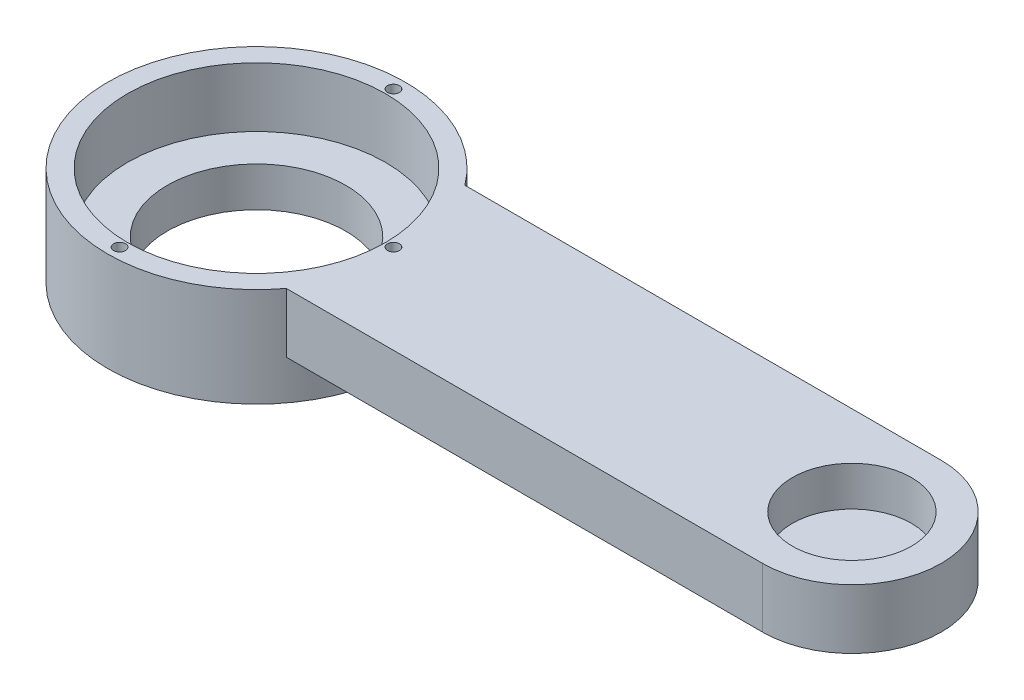
ISO-10303-21;
HEADER;
FILE_DESCRIPTION(('STEP AP214'),'2;1');
FILE_NAME('part.step','',(''),(''),'','','');
FILE_SCHEMA(('AUTOMOTIVE_DESIGN { 1 0 10303 214 1 1 1 1 }'));
ENDSEC;
DATA;
#1=APPLICATION_CONTEXT('core data for automotive mechanical design processes');
#2=APPLICATION_PROTOCOL_DEFINITION('international standard','automotive_design',2000,#1);
#3=PRODUCT_CONTEXT('',#1,'mechanical');
#4=PRODUCT('Part','Part','',(#3));
#5=PRODUCT_RELATED_PRODUCT_CATEGORY('part','',(#4));
#6=PRODUCT_DEFINITION_FORMATION('','',#4);
#7=PRODUCT_DEFINITION_CONTEXT('part definition',#1,'design');
#8=PRODUCT_DEFINITION('design','',#6,#7);
#9=PRODUCT_DEFINITION_SHAPE('','',#8);
#10=(LENGTH_UNIT() NAMED_UNIT(*) SI_UNIT(.MILLI.,.METRE.));
#11=(NAMED_UNIT(*) PLANE_ANGLE_UNIT() SI_UNIT($,.RADIAN.));
#12=(NAMED_UNIT(*) SI_UNIT($,.STERADIAN.) SOLID_ANGLE_UNIT());
#13=UNCERTAINTY_MEASURE_WITH_UNIT(LENGTH_MEASURE(1.E-05),#10,'distance_accuracy_value','');
#14=(GEOMETRIC_REPRESENTATION_CONTEXT(3) GLOBAL_UNCERTAINTY_ASSIGNED_CONTEXT((#13)) GLOBAL_UNIT_ASSIGNED_CONTEXT((#10,
#11,#12)) REPRESENTATION_CONTEXT('',''));
#15=CARTESIAN_POINT('',(0.,0.,0.));
#16=DIRECTION('',(0.,0.,1.));
#17=DIRECTION('',(1.,0.,0.));
#18=AXIS2_PLACEMENT_3D('',#15,#16,#17);
#19=CARTESIAN_POINT('',(150.,15.,0.));
#20=DIRECTION('',(0.,-1.,0.));
#21=DIRECTION('',(0.,0.,-1.));
#22=AXIS2_PLACEMENT_3D('',#19,#20,#21);
#23=CYLINDRICAL_SURFACE('',#22,15.);
#24=CARTESIAN_POINT('',(150.,15.,0.));
#25=DIRECTION('',(0.,-1.,0.));
#26=DIRECTION('',(0.,0.,-1.));
#27=AXIS2_PLACEMENT_3D('',#24,#25,#26);
#28=CIRCLE('',#27,15.);
#29=CARTESIAN_POINT('',(150.,15.,-15.));
#30=VERTEX_POINT('',#29);
#31=EDGE_CURVE('E118',#30,#30,#28,.T.);
#32=ORIENTED_EDGE('',*,*,#31,.F.);
#33=EDGE_LOOP('',(#32));
#34=FACE_BOUND('',#33,.T.);
#35=CARTESIAN_POINT('',(150.,5.,0.));
#36=DIRECTION('',(0.,-1.,0.));
#37=DIRECTION('',(0.,0.,-1.));
#38=AXIS2_PLACEMENT_3D('',#35,#36,#37);
#39=CIRCLE('',#38,15.);
#40=CARTESIAN_POINT('',(150.,5.,-15.));
#41=VERTEX_POINT('',#40);
#42=EDGE_CURVE('E12',#41,#41,#39,.F.);
#43=ORIENTED_EDGE('',*,*,#42,.F.);
#44=EDGE_LOOP('',(#43));
#45=FACE_BOUND('',#44,.T.);
#46=ADVANCED_FACE('F41',(#34,#45),#23,.F.);
#47=CARTESIAN_POINT('',(0.,-10.,0.));
#48=DIRECTION('',(0.,1.,0.));
#49=DIRECTION('',(0.,0.,1.));
#50=AXIS2_PLACEMENT_3D('',#47,#48,#49);
#51=CYLINDRICAL_SURFACE('',#50,22.5);
#52=CARTESIAN_POINT('',(0.,-10.,0.));
#53=DIRECTION('',(0.,1.,0.));
#54=DIRECTION('',(0.,0.,1.));
#55=AXIS2_PLACEMENT_3D('',#52,#53,#54);
#56=CIRCLE('',#55,22.5);
#57=CARTESIAN_POINT('',(0.,-10.,22.5));
#58=VERTEX_POINT('',#57);
#59=EDGE_CURVE('E105',#58,#58,#56,.T.);
#60=ORIENTED_EDGE('',*,*,#59,.F.);
#61=EDGE_LOOP('',(#60));
#62=FACE_BOUND('',#61,.T.);
#63=CARTESIAN_POINT('',(0.,0.,0.));
#64=DIRECTION('',(0.,1.,0.));
#65=DIRECTION('',(0.,0.,1.));
#66=AXIS2_PLACEMENT_3D('',#63,#64,#65);
#67=CIRCLE('',#66,22.5);
#68=CARTESIAN_POINT('',(0.,0.,22.5));
#69=VERTEX_POINT('',#68);
#70=EDGE_CURVE('E103',#69,#69,#67,.F.);
#71=ORIENTED_EDGE('',*,*,#70,.F.);
#72=EDGE_LOOP('',(#71));
#73=FACE_BOUND('',#72,.T.);
#74=ADVANCED_FACE('F154',(#62,#73),#51,.F.);
#75=CARTESIAN_POINT('',(0.,15.,22.5));
#76=DIRECTION('',(0.,0.,-1.));
#77=DIRECTION('',(-1.,0.,0.));
#78=AXIS2_PLACEMENT_3D('',#75,#76,#77);
#79=PLANE('',#78);
#80=DIRECTION('',(1.,0.,0.));
#81=VECTOR('',#80,1.);
#82=CARTESIAN_POINT('',(0.,15.,22.5));
#83=LINE('',#82,#81);
#84=CARTESIAN_POINT('',(30.,15.,22.5));
#85=VERTEX_POINT('',#84);
#86=CARTESIAN_POINT('',(150.,15.,22.5));
#87=VERTEX_POINT('',#86);
#88=EDGE_CURVE('E97',#85,#87,#83,.T.);
#89=ORIENTED_EDGE('',*,*,#88,.F.);
#90=DIRECTION('',(0.,1.,0.));
#91=VECTOR('',#90,1.);
#92=CARTESIAN_POINT('',(30.,-10.,22.5));
#93=LINE('',#92,#91);
#94=CARTESIAN_POINT('',(30.,0.,22.5));
#95=VERTEX_POINT('',#94);
#96=EDGE_CURVE('E128',#85,#95,#93,.F.);
#97=ORIENTED_EDGE('',*,*,#96,.T.);
#98=DIRECTION('',(1.,0.,0.));
#99=VECTOR('',#98,1.);
#100=CARTESIAN_POINT('',(0.,0.,22.5));
#101=LINE('',#100,#99);
#102=CARTESIAN_POINT('',(150.,0.,22.5));
#103=VERTEX_POINT('',#102);
#104=EDGE_CURVE('E89',#95,#103,#101,.T.);
#105=ORIENTED_EDGE('',*,*,#104,.T.);
#106=DIRECTION('',(0.,-1.,0.));
#107=VECTOR('',#106,1.);
#108=CARTESIAN_POINT('',(150.,15.,22.5));
#109=LINE('',#108,#107);
#110=EDGE_CURVE('E84',#87,#103,#109,.T.);
#111=ORIENTED_EDGE('',*,*,#110,.F.);
#112=EDGE_LOOP('',(#89,#97,#105,#111));
#113=FACE_BOUND('',#112,.T.);
#114=ADVANCED_FACE('F43',(#113),#79,.F.);
#115=CARTESIAN_POINT('',(150.,15.,0.));
#116=DIRECTION('',(0.,-1.,0.));
#117=DIRECTION('',(0.,0.,-1.));
#118=AXIS2_PLACEMENT_3D('',#115,#116,#117);
#119=CYLINDRICAL_SURFACE('',#118,22.5);
#120=CARTESIAN_POINT('',(150.,0.,0.));
#121=DIRECTION('',(0.,1.,0.));
#122=DIRECTION('',(0.,0.,1.));
#123=AXIS2_PLACEMENT_3D('',#120,#121,#122);
#124=CIRCLE('',#123,22.5);
#125=CARTESIAN_POINT('',(150.,0.,-22.5));
#126=VERTEX_POINT('',#125);
#127=EDGE_CURVE('E78',#103,#126,#124,.T.);
#128=ORIENTED_EDGE('',*,*,#127,.T.);
#129=DIRECTION('',(0.,-1.,0.));
#130=VECTOR('',#129,1.);
#131=CARTESIAN_POINT('',(150.,15.,-22.5));
#132=LINE('',#131,#130);
#133=CARTESIAN_POINT('',(150.,15.,-22.5));
#134=VERTEX_POINT('',#133);
#135=EDGE_CURVE('E81',#134,#126,#132,.T.);
#136=ORIENTED_EDGE('',*,*,#135,.F.);
#137=CARTESIAN_POINT('',(150.,15.,0.));
#138=DIRECTION('',(0.,1.,0.));
#139=DIRECTION('',(0.,0.,1.));
#140=AXIS2_PLACEMENT_3D('',#137,#138,#139);
#141=CIRCLE('',#140,22.5);
#142=EDGE_CURVE('E65',#87,#134,#141,.T.);
#143=ORIENTED_EDGE('',*,*,#142,.F.);
#144=ORIENTED_EDGE('',*,*,#110,.T.);
#145=EDGE_LOOP('',(#128,#136,#143,#144));
#146=FACE_BOUND('',#145,.T.);
#147=ADVANCED_FACE('F80',(#146),#119,.T.);
#148=CARTESIAN_POINT('',(0.,15.,-22.5));
#149=DIRECTION('',(0.,0.,1.));
#150=DIRECTION('',(1.,0.,0.));
#151=AXIS2_PLACEMENT_3D('',#148,#149,#150);
#152=PLANE('',#151);
#153=DIRECTION('',(-1.,0.,0.));
#154=VECTOR('',#153,1.);
#155=CARTESIAN_POINT('',(0.,0.,-22.5));
#156=LINE('',#155,#154);
#157=CARTESIAN_POINT('',(30.,0.,-22.5));
#158=VERTEX_POINT('',#157);
#159=EDGE_CURVE('E88',#126,#158,#156,.T.);
#160=ORIENTED_EDGE('',*,*,#159,.T.);
#161=DIRECTION('',(0.,1.,0.));
#162=VECTOR('',#161,1.);
#163=CARTESIAN_POINT('',(30.,-10.,-22.5));
#164=LINE('',#163,#162);
#165=CARTESIAN_POINT('',(30.,15.,-22.5));
#166=VERTEX_POINT('',#165);
#167=EDGE_CURVE('E56',#158,#166,#164,.T.);
#168=ORIENTED_EDGE('',*,*,#167,.T.);
#169=DIRECTION('',(-1.,0.,0.));
#170=VECTOR('',#169,1.);
#171=CARTESIAN_POINT('',(0.,15.,-22.5));
#172=LINE('',#171,#170);
#173=EDGE_CURVE('E94',#134,#166,#172,.T.);
#174=ORIENTED_EDGE('',*,*,#173,.F.);
#175=ORIENTED_EDGE('',*,*,#135,.T.);
#176=EDGE_LOOP('',(#160,#168,#174,#175));
#177=FACE_BOUND('',#176,.T.);
#178=ADVANCED_FACE('F93',(#177),#152,.F.);
#179=CARTESIAN_POINT('',(0.,15.,0.));
#180=DIRECTION('',(0.,1.,0.));
#181=DIRECTION('',(0.,0.,1.));
#182=AXIS2_PLACEMENT_3D('',#179,#180,#181);
#183=PLANE('',#182);
#184=CARTESIAN_POINT('',(0.,15.,34.5));
#185=DIRECTION('',(0.,1.,0.));
#186=DIRECTION('',(0.,0.,1.));
#187=AXIS2_PLACEMENT_3D('',#184,#185,#186);
#188=CIRCLE('',#187,1.5);
#189=CARTESIAN_POINT('',(0.,15.,36.));
#190=VERTEX_POINT('',#189);
#191=EDGE_CURVE('E322',#190,#190,#188,.T.);
#192=ORIENTED_EDGE('',*,*,#191,.F.);
#193=EDGE_LOOP('',(#192));
#194=FACE_BOUND('',#193,.T.);
#195=CARTESIAN_POINT('',(34.5,15.,0.));
#196=DIRECTION('',(0.,1.,0.));
#197=DIRECTION('',(0.,0.,1.));
#198=AXIS2_PLACEMENT_3D('',#195,#196,#197);
#199=CIRCLE('',#198,1.5);
#200=CARTESIAN_POINT('',(34.5,15.,1.5));
#201=VERTEX_POINT('',#200);
#202=EDGE_CURVE('E331',#201,#201,#199,.T.);
#203=ORIENTED_EDGE('',*,*,#202,.F.);
#204=EDGE_LOOP('',(#203));
#205=FACE_BOUND('',#204,.T.);
#206=CARTESIAN_POINT('',(0.,15.,-34.5));
#207=DIRECTION('',(0.,1.,0.));
#208=DIRECTION('',(0.,0.,1.));
#209=AXIS2_PLACEMENT_3D('',#206,#207,#208);
#210=CIRCLE('',#209,1.50000000000001);
#211=CARTESIAN_POINT('',(0.,15.,-33.));
#212=VERTEX_POINT('',#211);
#213=EDGE_CURVE('E337',#212,#212,#210,.T.);
#214=ORIENTED_EDGE('',*,*,#213,.F.);
#215=EDGE_LOOP('',(#214));
#216=FACE_BOUND('',#215,.T.);
#217=ORIENTED_EDGE('',*,*,#31,.T.);
#218=EDGE_LOOP('',(#217));
#219=FACE_BOUND('',#218,.T.);
#220=CARTESIAN_POINT('',(0.,15.,0.));
#221=DIRECTION('',(0.,1.,0.));
#222=DIRECTION('',(0.,0.,1.));
#223=AXIS2_PLACEMENT_3D('',#220,#221,#222);
#224=CIRCLE('',#223,32.5);
#225=CARTESIAN_POINT('',(0.,15.,32.5));
#226=VERTEX_POINT('',#225);
#227=EDGE_CURVE('E113',#226,#226,#224,.T.);
#228=ORIENTED_EDGE('',*,*,#227,.F.);
#229=EDGE_LOOP('',(#228));
#230=FACE_BOUND('',#229,.T.);
#231=CARTESIAN_POINT('',(0.,15.,0.));
#232=DIRECTION('',(0.,1.,0.));
#233=DIRECTION('',(0.,0.,1.));
#234=AXIS2_PLACEMENT_3D('',#231,#232,#233);
#235=CIRCLE('',#234,37.5);
#236=EDGE_CURVE('E110',#166,#85,#235,.T.);
#237=ORIENTED_EDGE('',*,*,#236,.T.);
#238=ORIENTED_EDGE('',*,*,#88,.T.);
#239=ORIENTED_EDGE('',*,*,#142,.T.);
#240=ORIENTED_EDGE('',*,*,#173,.T.);
#241=EDGE_LOOP('',(#237,#238,#239,#240));
#242=FACE_BOUND('',#241,.T.);
#243=ADVANCED_FACE('F140',(#194,#205,#216,#219,#230,#242),#183,.T.);
#244=CARTESIAN_POINT('',(0.,0.,0.));
#245=DIRECTION('',(0.,1.,0.));
#246=DIRECTION('',(0.,0.,1.));
#247=AXIS2_PLACEMENT_3D('',#244,#245,#246);
#248=PLANE('',#247);
#249=ORIENTED_EDGE('',*,*,#104,.F.);
#250=CARTESIAN_POINT('',(0.,0.,0.));
#251=DIRECTION('',(0.,1.,0.));
#252=DIRECTION('',(0.,0.,1.));
#253=AXIS2_PLACEMENT_3D('',#250,#251,#252);
#254=CIRCLE('',#253,37.5);
#255=EDGE_CURVE('E49',#95,#158,#254,.T.);
#256=ORIENTED_EDGE('',*,*,#255,.T.);
#257=ORIENTED_EDGE('',*,*,#159,.F.);
#258=ORIENTED_EDGE('',*,*,#127,.F.);
#259=EDGE_LOOP('',(#249,#256,#257,#258));
#260=FACE_BOUND('',#259,.T.);
#261=ADVANCED_FACE('F96',(#260),#248,.F.);
#262=CARTESIAN_POINT('',(0.,-10.,0.));
#263=DIRECTION('',(0.,1.,0.));
#264=DIRECTION('',(0.,0.,1.));
#265=AXIS2_PLACEMENT_3D('',#262,#263,#264);
#266=CYLINDRICAL_SURFACE('',#265,37.5);
#267=CARTESIAN_POINT('',(0.,-10.,0.));
#268=DIRECTION('',(0.,1.,0.));
#269=DIRECTION('',(0.,0.,1.));
#270=AXIS2_PLACEMENT_3D('',#267,#268,#269);
#271=CIRCLE('',#270,37.5);
#272=CARTESIAN_POINT('',(0.,-10.,37.5));
#273=VERTEX_POINT('',#272);
#274=EDGE_CURVE('E122',#273,#273,#271,.T.);
#275=ORIENTED_EDGE('',*,*,#274,.T.);
#276=EDGE_LOOP('',(#275));
#277=FACE_BOUND('',#276,.T.);
#278=ORIENTED_EDGE('',*,*,#96,.F.);
#279=ORIENTED_EDGE('',*,*,#236,.F.);
#280=ORIENTED_EDGE('',*,*,#167,.F.);
#281=ORIENTED_EDGE('',*,*,#255,.F.);
#282=EDGE_LOOP('',(#278,#279,#280,#281));
#283=FACE_BOUND('',#282,.T.);
#284=ADVANCED_FACE('F139',(#277,#283),#266,.T.);
#285=CARTESIAN_POINT('',(0.,-10.,0.));
#286=DIRECTION('',(0.,1.,0.));
#287=DIRECTION('',(0.,0.,1.));
#288=AXIS2_PLACEMENT_3D('',#285,#286,#287);
#289=PLANE('',#288);
#290=ORIENTED_EDGE('',*,*,#59,.T.);
#291=EDGE_LOOP('',(#290));
#292=FACE_BOUND('',#291,.T.);
#293=ORIENTED_EDGE('',*,*,#274,.F.);
#294=EDGE_LOOP('',(#293));
#295=FACE_BOUND('',#294,.T.);
#296=ADVANCED_FACE('F172',(#292,#295),#289,.F.);
#297=CARTESIAN_POINT('',(0.,0.,0.));
#298=DIRECTION('',(0.,1.,0.));
#299=DIRECTION('',(0.,0.,1.));
#300=AXIS2_PLACEMENT_3D('',#297,#298,#299);
#301=PLANE('',#300);
#302=CARTESIAN_POINT('',(0.,0.,0.));
#303=DIRECTION('',(0.,1.,0.));
#304=DIRECTION('',(0.,0.,1.));
#305=AXIS2_PLACEMENT_3D('',#302,#303,#304);
#306=CIRCLE('',#305,32.5);
#307=CARTESIAN_POINT('',(0.,0.,32.5));
#308=VERTEX_POINT('',#307);
#309=EDGE_CURVE('E106',#308,#308,#306,.F.);
#310=ORIENTED_EDGE('',*,*,#309,.F.);
#311=EDGE_LOOP('',(#310));
#312=FACE_BOUND('',#311,.T.);
#313=ORIENTED_EDGE('',*,*,#70,.T.);
#314=EDGE_LOOP('',(#313));
#315=FACE_BOUND('',#314,.T.);
#316=ADVANCED_FACE('F168',(#312,#315),#301,.T.);
#317=CARTESIAN_POINT('',(0.,-101.923881554251,0.));
#318=DIRECTION('',(0.,1.,0.));
#319=DIRECTION('',(0.,0.,1.));
#320=AXIS2_PLACEMENT_3D('',#317,#318,#319);
#321=CYLINDRICAL_SURFACE('',#320,32.5);
#322=ORIENTED_EDGE('',*,*,#309,.T.);
#323=EDGE_LOOP('',(#322));
#324=FACE_BOUND('',#323,.T.);
#325=ORIENTED_EDGE('',*,*,#227,.T.);
#326=EDGE_LOOP('',(#325));
#327=FACE_BOUND('',#326,.T.);
#328=ADVANCED_FACE('F171',(#324,#327),#321,.F.);
#329=CARTESIAN_POINT('',(150.,5.,0.));
#330=DIRECTION('',(0.,-1.,0.));
#331=DIRECTION('',(0.,0.,-1.));
#332=AXIS2_PLACEMENT_3D('',#329,#330,#331);
#333=PLANE('',#332);
#334=ORIENTED_EDGE('',*,*,#42,.T.);
#335=EDGE_LOOP('',(#334));
#336=FACE_BOUND('',#335,.T.);
#337=ADVANCED_FACE('F166',(#336),#333,.F.);
#338=CARTESIAN_POINT('',(0.,12.,-34.5));
#339=DIRECTION('',(0.,1.,0.));
#340=DIRECTION('',(0.,0.,1.));
#341=AXIS2_PLACEMENT_3D('',#338,#339,#340);
#342=CYLINDRICAL_SURFACE('',#341,1.50000000000001);
#343=CARTESIAN_POINT('',(0.,12.,-34.5));
#344=DIRECTION('',(0.,1.,0.));
#345=DIRECTION('',(0.,0.,1.));
#346=AXIS2_PLACEMENT_3D('',#343,#344,#345);
#347=CIRCLE('',#346,1.50000000000001);
#348=CARTESIAN_POINT('',(0.,12.,-33.));
#349=VERTEX_POINT('',#348);
#350=EDGE_CURVE('E334',#349,#349,#347,.T.);
#351=ORIENTED_EDGE('',*,*,#350,.F.);
#352=EDGE_LOOP('',(#351));
#353=FACE_BOUND('',#352,.T.);
#354=ORIENTED_EDGE('',*,*,#213,.T.);
#355=EDGE_LOOP('',(#354));
#356=FACE_BOUND('',#355,.T.);
#357=ADVANCED_FACE('F206',(#353,#356),#342,.F.);
#358=CARTESIAN_POINT('',(0.,12.,-34.5));
#359=DIRECTION('',(0.,1.,0.));
#360=DIRECTION('',(0.,0.,1.));
#361=AXIS2_PLACEMENT_3D('',#358,#359,#360);
#362=PLANE('',#361);
#363=ORIENTED_EDGE('',*,*,#350,.T.);
#364=EDGE_LOOP('',(#363));
#365=FACE_BOUND('',#364,.T.);
#366=ADVANCED_FACE('F213',(#365),#362,.T.);
#367=CARTESIAN_POINT('',(34.5,12.,0.));
#368=DIRECTION('',(0.,1.,0.));
#369=DIRECTION('',(0.,0.,1.));
#370=AXIS2_PLACEMENT_3D('',#367,#368,#369);
#371=CYLINDRICAL_SURFACE('',#370,1.5);
#372=CARTESIAN_POINT('',(34.5,12.,0.));
#373=DIRECTION('',(0.,1.,0.));
#374=DIRECTION('',(0.,0.,1.));
#375=AXIS2_PLACEMENT_3D('',#372,#373,#374);
#376=CIRCLE('',#375,1.5);
#377=CARTESIAN_POINT('',(34.5,12.,1.5));
#378=VERTEX_POINT('',#377);
#379=EDGE_CURVE('E326',#378,#378,#376,.T.);
#380=ORIENTED_EDGE('',*,*,#379,.F.);
#381=EDGE_LOOP('',(#380));
#382=FACE_BOUND('',#381,.T.);
#383=ORIENTED_EDGE('',*,*,#202,.T.);
#384=EDGE_LOOP('',(#383));
#385=FACE_BOUND('',#384,.T.);
#386=ADVANCED_FACE('F220',(#382,#385),#371,.F.);
#387=CARTESIAN_POINT('',(34.5,12.,0.));
#388=DIRECTION('',(0.,1.,0.));
#389=DIRECTION('',(0.,0.,1.));
#390=AXIS2_PLACEMENT_3D('',#387,#388,#389);
#391=PLANE('',#390);
#392=ORIENTED_EDGE('',*,*,#379,.T.);
#393=EDGE_LOOP('',(#392));
#394=FACE_BOUND('',#393,.T.);
#395=ADVANCED_FACE('F228',(#394),#391,.T.);
#396=CARTESIAN_POINT('',(0.,12.,34.5));
#397=DIRECTION('',(0.,1.,0.));
#398=DIRECTION('',(0.,0.,1.));
#399=AXIS2_PLACEMENT_3D('',#396,#397,#398);
#400=CYLINDRICAL_SURFACE('',#399,1.5);
#401=CARTESIAN_POINT('',(0.,12.,34.5));
#402=DIRECTION('',(0.,1.,0.));
#403=DIRECTION('',(0.,0.,1.));
#404=AXIS2_PLACEMENT_3D('',#401,#402,#403);
#405=CIRCLE('',#404,1.5);
#406=CARTESIAN_POINT('',(0.,12.,36.));
#407=VERTEX_POINT('',#406);
#408=EDGE_CURVE('E321',#407,#407,#405,.T.);
#409=ORIENTED_EDGE('',*,*,#408,.F.);
#410=EDGE_LOOP('',(#409));
#411=FACE_BOUND('',#410,.T.);
#412=ORIENTED_EDGE('',*,*,#191,.T.);
#413=EDGE_LOOP('',(#412));
#414=FACE_BOUND('',#413,.T.);
#415=ADVANCED_FACE('F236',(#411,#414),#400,.F.);
#416=CARTESIAN_POINT('',(0.,12.,34.5));
#417=DIRECTION('',(0.,1.,0.));
#418=DIRECTION('',(0.,0.,1.));
#419=AXIS2_PLACEMENT_3D('',#416,#417,#418);
#420=PLANE('',#419);
#421=ORIENTED_EDGE('',*,*,#408,.T.);
#422=EDGE_LOOP('',(#421));
#423=FACE_BOUND('',#422,.T.);
#424=ADVANCED_FACE('F244',(#423),#420,.T.);
#425=CLOSED_SHELL('',(#46,#74,#114,#147,#178,#243,#261,#284,#296,#316,#328,#337,#357,#366,#386,
#395,#415,#424));
#426=MANIFOLD_SOLID_BREP('B2',#425);
#427=ADVANCED_BREP_SHAPE_REPRESENTATION('',(#18,#426),#14);
#428=SHAPE_DEFINITION_REPRESENTATION(#9,#427);
ENDSEC;
END-ISO-10303-21;
